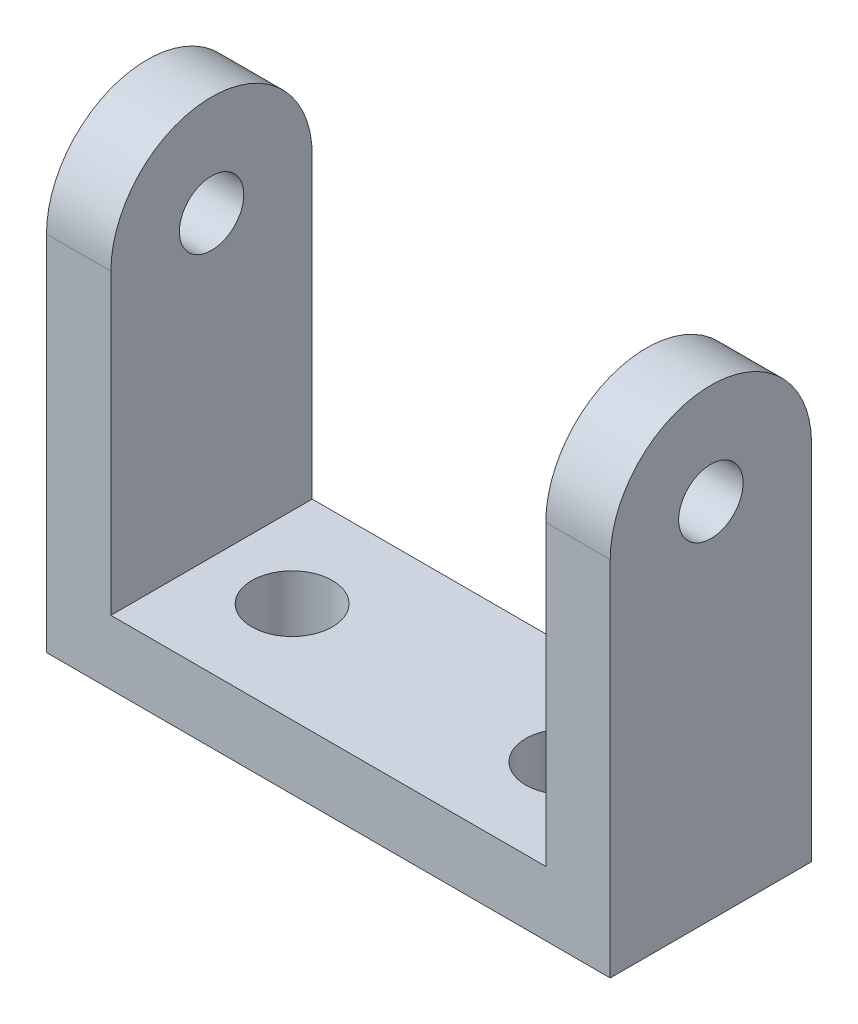
ISO-10303-21;
HEADER;
FILE_DESCRIPTION(('STEP AP214'),'2;1');
FILE_NAME('part.step','',(''),(''),'','','');
FILE_SCHEMA(('AUTOMOTIVE_DESIGN { 1 0 10303 214 1 1 1 1 }'));
ENDSEC;
DATA;
#1=APPLICATION_CONTEXT('core data for automotive mechanical design processes');
#2=APPLICATION_PROTOCOL_DEFINITION('international standard','automotive_design',2000,#1);
#3=PRODUCT_CONTEXT('',#1,'mechanical');
#4=PRODUCT('Part','Part','',(#3));
#5=PRODUCT_RELATED_PRODUCT_CATEGORY('part','',(#4));
#6=PRODUCT_DEFINITION_FORMATION('','',#4);
#7=PRODUCT_DEFINITION_CONTEXT('part definition',#1,'design');
#8=PRODUCT_DEFINITION('design','',#6,#7);
#9=PRODUCT_DEFINITION_SHAPE('','',#8);
#10=(LENGTH_UNIT() NAMED_UNIT(*) SI_UNIT(.MILLI.,.METRE.));
#11=(NAMED_UNIT(*) PLANE_ANGLE_UNIT() SI_UNIT($,.RADIAN.));
#12=(NAMED_UNIT(*) SI_UNIT($,.STERADIAN.) SOLID_ANGLE_UNIT());
#13=UNCERTAINTY_MEASURE_WITH_UNIT(LENGTH_MEASURE(1.E-05),#10,'distance_accuracy_value','');
#14=(GEOMETRIC_REPRESENTATION_CONTEXT(3) GLOBAL_UNCERTAINTY_ASSIGNED_CONTEXT((#13)) GLOBAL_UNIT_ASSIGNED_CONTEXT((#10,
#11,#12)) REPRESENTATION_CONTEXT('',''));
#15=CARTESIAN_POINT('',(0.,0.,0.));
#16=DIRECTION('',(0.,0.,1.));
#17=DIRECTION('',(1.,0.,0.));
#18=AXIS2_PLACEMENT_3D('',#15,#16,#17);
#19=CARTESIAN_POINT('',(35.,0.,-25.));
#20=DIRECTION('',(1.,0.,0.));
#21=DIRECTION('',(0.,0.,-1.));
#22=AXIS2_PLACEMENT_3D('',#19,#20,#21);
#23=PLANE('',#22);
#24=CARTESIAN_POINT('',(35.,45.,-12.5));
#25=DIRECTION('',(1.,0.,0.));
#26=DIRECTION('',(0.,0.,-1.));
#27=AXIS2_PLACEMENT_3D('',#24,#25,#26);
#28=CIRCLE('',#27,3.99999999999999);
#29=CARTESIAN_POINT('',(35.,45.,-16.5));
#30=VERTEX_POINT('',#29);
#31=EDGE_CURVE('E165',#30,#30,#28,.T.);
#32=ORIENTED_EDGE('',*,*,#31,.F.);
#33=EDGE_LOOP('',(#32));
#34=FACE_BOUND('',#33,.T.);
#35=DIRECTION('',(0.,1.,0.));
#36=VECTOR('',#35,1.);
#37=CARTESIAN_POINT('',(35.,0.,0.));
#38=LINE('',#37,#36);
#39=CARTESIAN_POINT('',(35.,0.,0.));
#40=VERTEX_POINT('',#39);
#41=CARTESIAN_POINT('',(35.,45.,0.));
#42=VERTEX_POINT('',#41);
#43=EDGE_CURVE('E178',#40,#42,#38,.T.);
#44=ORIENTED_EDGE('',*,*,#43,.F.);
#45=DIRECTION('',(0.,0.,1.));
#46=VECTOR('',#45,1.);
#47=CARTESIAN_POINT('',(35.,0.,-25.));
#48=LINE('',#47,#46);
#49=CARTESIAN_POINT('',(35.,0.,-25.));
#50=VERTEX_POINT('',#49);
#51=EDGE_CURVE('E11',#50,#40,#48,.T.);
#52=ORIENTED_EDGE('',*,*,#51,.F.);
#53=DIRECTION('',(0.,1.,0.));
#54=VECTOR('',#53,1.);
#55=CARTESIAN_POINT('',(35.,0.,-25.));
#56=LINE('',#55,#54);
#57=CARTESIAN_POINT('',(35.,45.,-25.));
#58=VERTEX_POINT('',#57);
#59=EDGE_CURVE('E182',#50,#58,#56,.T.);
#60=ORIENTED_EDGE('',*,*,#59,.T.);
#61=CARTESIAN_POINT('',(35.,45.,-12.5));
#62=DIRECTION('',(1.,0.,0.));
#63=DIRECTION('',(0.,0.,1.));
#64=AXIS2_PLACEMENT_3D('',#61,#62,#63);
#65=CIRCLE('',#64,12.5);
#66=EDGE_CURVE('E173',#58,#42,#65,.T.);
#67=ORIENTED_EDGE('',*,*,#66,.T.);
#68=EDGE_LOOP('',(#44,#52,#60,#67));
#69=FACE_BOUND('',#68,.T.);
#70=ADVANCED_FACE('F39',(#34,#69),#23,.T.);
#71=CARTESIAN_POINT('',(0.,0.,-25.));
#72=DIRECTION('',(0.,-1.,0.));
#73=DIRECTION('',(0.,0.,-1.));
#74=AXIS2_PLACEMENT_3D('',#71,#72,#73);
#75=PLANE('',#74);
#76=CARTESIAN_POINT('',(-17.,0.,-12.5));
#77=DIRECTION('',(0.,1.,0.));
#78=DIRECTION('',(0.,0.,1.));
#79=AXIS2_PLACEMENT_3D('',#76,#77,#78);
#80=CIRCLE('',#79,5.);
#81=CARTESIAN_POINT('',(-17.,0.,-7.5));
#82=VERTEX_POINT('',#81);
#83=EDGE_CURVE('E232',#82,#82,#80,.T.);
#84=ORIENTED_EDGE('',*,*,#83,.T.);
#85=EDGE_LOOP('',(#84));
#86=FACE_BOUND('',#85,.T.);
#87=CARTESIAN_POINT('',(17.,0.,-12.5));
#88=DIRECTION('',(0.,1.,0.));
#89=DIRECTION('',(0.,0.,1.));
#90=AXIS2_PLACEMENT_3D('',#87,#88,#89);
#91=CIRCLE('',#90,5.);
#92=CARTESIAN_POINT('',(17.,0.,-7.5));
#93=VERTEX_POINT('',#92);
#94=EDGE_CURVE('E161',#93,#93,#91,.T.);
#95=ORIENTED_EDGE('',*,*,#94,.T.);
#96=EDGE_LOOP('',(#95));
#97=FACE_BOUND('',#96,.T.);
#98=DIRECTION('',(1.,0.,0.));
#99=VECTOR('',#98,1.);
#100=CARTESIAN_POINT('',(0.,0.,0.));
#101=LINE('',#100,#99);
#102=CARTESIAN_POINT('',(-35.,0.,0.));
#103=VERTEX_POINT('',#102);
#104=EDGE_CURVE('E185',#103,#40,#101,.T.);
#105=ORIENTED_EDGE('',*,*,#104,.F.);
#106=DIRECTION('',(0.,0.,1.));
#107=VECTOR('',#106,1.);
#108=CARTESIAN_POINT('',(-35.,0.,-25.));
#109=LINE('',#108,#107);
#110=CARTESIAN_POINT('',(-35.,0.,-25.));
#111=VERTEX_POINT('',#110);
#112=EDGE_CURVE('E121',#111,#103,#109,.T.);
#113=ORIENTED_EDGE('',*,*,#112,.F.);
#114=DIRECTION('',(1.,0.,0.));
#115=VECTOR('',#114,1.);
#116=CARTESIAN_POINT('',(0.,0.,-25.));
#117=LINE('',#116,#115);
#118=EDGE_CURVE('E135',#111,#50,#117,.T.);
#119=ORIENTED_EDGE('',*,*,#118,.T.);
#120=ORIENTED_EDGE('',*,*,#51,.T.);
#121=EDGE_LOOP('',(#105,#113,#119,#120));
#122=FACE_BOUND('',#121,.T.);
#123=ADVANCED_FACE('F221',(#86,#97,#122),#75,.T.);
#124=CARTESIAN_POINT('',(0.,8.,-25.));
#125=DIRECTION('',(0.,-1.,0.));
#126=DIRECTION('',(0.,0.,-1.));
#127=AXIS2_PLACEMENT_3D('',#124,#125,#126);
#128=PLANE('',#127);
#129=CARTESIAN_POINT('',(-17.,8.,-12.5));
#130=DIRECTION('',(0.,1.,0.));
#131=DIRECTION('',(0.,0.,1.));
#132=AXIS2_PLACEMENT_3D('',#129,#130,#131);
#133=CIRCLE('',#132,5.);
#134=CARTESIAN_POINT('',(-17.,8.,-7.5));
#135=VERTEX_POINT('',#134);
#136=EDGE_CURVE('E236',#135,#135,#133,.T.);
#137=ORIENTED_EDGE('',*,*,#136,.F.);
#138=EDGE_LOOP('',(#137));
#139=FACE_BOUND('',#138,.T.);
#140=CARTESIAN_POINT('',(17.,8.,-12.5));
#141=DIRECTION('',(0.,1.,0.));
#142=DIRECTION('',(0.,0.,1.));
#143=AXIS2_PLACEMENT_3D('',#140,#141,#142);
#144=CIRCLE('',#143,5.);
#145=CARTESIAN_POINT('',(17.,8.,-7.5));
#146=VERTEX_POINT('',#145);
#147=EDGE_CURVE('E155',#146,#146,#144,.T.);
#148=ORIENTED_EDGE('',*,*,#147,.F.);
#149=EDGE_LOOP('',(#148));
#150=FACE_BOUND('',#149,.T.);
#151=DIRECTION('',(1.,0.,0.));
#152=VECTOR('',#151,1.);
#153=CARTESIAN_POINT('',(0.,8.,0.));
#154=LINE('',#153,#152);
#155=CARTESIAN_POINT('',(-27.,8.,0.));
#156=VERTEX_POINT('',#155);
#157=CARTESIAN_POINT('',(27.,8.,0.));
#158=VERTEX_POINT('',#157);
#159=EDGE_CURVE('E72',#156,#158,#154,.T.);
#160=ORIENTED_EDGE('',*,*,#159,.T.);
#161=DIRECTION('',(0.,0.,1.));
#162=VECTOR('',#161,1.);
#163=CARTESIAN_POINT('',(27.,8.,-25.));
#164=LINE('',#163,#162);
#165=CARTESIAN_POINT('',(27.,8.,-25.));
#166=VERTEX_POINT('',#165);
#167=EDGE_CURVE('E49',#166,#158,#164,.T.);
#168=ORIENTED_EDGE('',*,*,#167,.F.);
#169=DIRECTION('',(1.,0.,0.));
#170=VECTOR('',#169,1.);
#171=CARTESIAN_POINT('',(0.,8.,-25.));
#172=LINE('',#171,#170);
#173=CARTESIAN_POINT('',(-27.,8.,-25.));
#174=VERTEX_POINT('',#173);
#175=EDGE_CURVE('E191',#174,#166,#172,.T.);
#176=ORIENTED_EDGE('',*,*,#175,.F.);
#177=DIRECTION('',(0.,0.,1.));
#178=VECTOR('',#177,1.);
#179=CARTESIAN_POINT('',(-27.,8.,-25.));
#180=LINE('',#179,#178);
#181=EDGE_CURVE('E152',#174,#156,#180,.T.);
#182=ORIENTED_EDGE('',*,*,#181,.T.);
#183=EDGE_LOOP('',(#160,#168,#176,#182));
#184=FACE_BOUND('',#183,.T.);
#185=ADVANCED_FACE('F243',(#139,#150,#184),#128,.F.);
#186=CARTESIAN_POINT('',(27.,0.,-25.));
#187=DIRECTION('',(1.,0.,0.));
#188=DIRECTION('',(0.,0.,-1.));
#189=AXIS2_PLACEMENT_3D('',#186,#187,#188);
#190=PLANE('',#189);
#191=CARTESIAN_POINT('',(27.,45.,-12.5));
#192=DIRECTION('',(1.,0.,0.));
#193=DIRECTION('',(0.,0.,-1.));
#194=AXIS2_PLACEMENT_3D('',#191,#192,#193);
#195=CIRCLE('',#194,3.99999999999999);
#196=CARTESIAN_POINT('',(27.,45.,-16.5));
#197=VERTEX_POINT('',#196);
#198=EDGE_CURVE('E169',#197,#197,#195,.T.);
#199=ORIENTED_EDGE('',*,*,#198,.T.);
#200=EDGE_LOOP('',(#199));
#201=FACE_BOUND('',#200,.T.);
#202=DIRECTION('',(0.,1.,0.));
#203=VECTOR('',#202,1.);
#204=CARTESIAN_POINT('',(27.,0.,0.));
#205=LINE('',#204,#203);
#206=CARTESIAN_POINT('',(27.,45.,0.));
#207=VERTEX_POINT('',#206);
#208=EDGE_CURVE('E202',#158,#207,#205,.T.);
#209=ORIENTED_EDGE('',*,*,#208,.T.);
#210=CARTESIAN_POINT('',(27.,45.,-12.5));
#211=DIRECTION('',(1.,0.,0.));
#212=DIRECTION('',(0.,0.,-1.));
#213=AXIS2_PLACEMENT_3D('',#210,#211,#212);
#214=CIRCLE('',#213,12.5);
#215=CARTESIAN_POINT('',(27.,45.,-25.));
#216=VERTEX_POINT('',#215);
#217=EDGE_CURVE('E174',#207,#216,#214,.F.);
#218=ORIENTED_EDGE('',*,*,#217,.T.);
#219=DIRECTION('',(0.,1.,0.));
#220=VECTOR('',#219,1.);
#221=CARTESIAN_POINT('',(27.,0.,-25.));
#222=LINE('',#221,#220);
#223=EDGE_CURVE('E188',#166,#216,#222,.T.);
#224=ORIENTED_EDGE('',*,*,#223,.F.);
#225=ORIENTED_EDGE('',*,*,#167,.T.);
#226=EDGE_LOOP('',(#209,#218,#224,#225));
#227=FACE_BOUND('',#226,.T.);
#228=ADVANCED_FACE('F213',(#201,#227),#190,.F.);
#229=CARTESIAN_POINT('',(0.,0.,-25.));
#230=DIRECTION('',(0.,0.,-1.));
#231=DIRECTION('',(-1.,0.,0.));
#232=AXIS2_PLACEMENT_3D('',#229,#230,#231);
#233=PLANE('',#232);
#234=ORIENTED_EDGE('',*,*,#59,.F.);
#235=ORIENTED_EDGE('',*,*,#118,.F.);
#236=DIRECTION('',(0.,1.,0.));
#237=VECTOR('',#236,1.);
#238=CARTESIAN_POINT('',(-35.,0.,-25.));
#239=LINE('',#238,#237);
#240=CARTESIAN_POINT('',(-35.,45.,-25.));
#241=VERTEX_POINT('',#240);
#242=EDGE_CURVE('E128',#111,#241,#239,.T.);
#243=ORIENTED_EDGE('',*,*,#242,.T.);
#244=DIRECTION('',(-1.,0.,0.));
#245=VECTOR('',#244,1.);
#246=CARTESIAN_POINT('',(-27.,45.,-25.));
#247=LINE('',#246,#245);
#248=CARTESIAN_POINT('',(-27.,45.,-25.));
#249=VERTEX_POINT('',#248);
#250=EDGE_CURVE('E110',#249,#241,#247,.T.);
#251=ORIENTED_EDGE('',*,*,#250,.F.);
#252=DIRECTION('',(0.,1.,0.));
#253=VECTOR('',#252,1.);
#254=CARTESIAN_POINT('',(-27.,0.,-25.));
#255=LINE('',#254,#253);
#256=EDGE_CURVE('E122',#174,#249,#255,.T.);
#257=ORIENTED_EDGE('',*,*,#256,.F.);
#258=ORIENTED_EDGE('',*,*,#175,.T.);
#259=ORIENTED_EDGE('',*,*,#223,.T.);
#260=DIRECTION('',(1.,0.,0.));
#261=VECTOR('',#260,1.);
#262=CARTESIAN_POINT('',(27.,45.,-25.));
#263=LINE('',#262,#261);
#264=EDGE_CURVE('E83',#216,#58,#263,.T.);
#265=ORIENTED_EDGE('',*,*,#264,.T.);
#266=EDGE_LOOP('',(#234,#235,#243,#251,#257,#258,#259,#265));
#267=FACE_BOUND('',#266,.T.);
#268=ADVANCED_FACE('F134',(#267),#233,.T.);
#269=CARTESIAN_POINT('',(0.,0.,0.));
#270=DIRECTION('',(0.,0.,-1.));
#271=DIRECTION('',(-1.,0.,0.));
#272=AXIS2_PLACEMENT_3D('',#269,#270,#271);
#273=PLANE('',#272);
#274=ORIENTED_EDGE('',*,*,#43,.T.);
#275=DIRECTION('',(1.,0.,0.));
#276=VECTOR('',#275,1.);
#277=CARTESIAN_POINT('',(27.,45.,0.));
#278=LINE('',#277,#276);
#279=EDGE_CURVE('E198',#207,#42,#278,.T.);
#280=ORIENTED_EDGE('',*,*,#279,.F.);
#281=ORIENTED_EDGE('',*,*,#208,.F.);
#282=ORIENTED_EDGE('',*,*,#159,.F.);
#283=DIRECTION('',(0.,1.,0.));
#284=VECTOR('',#283,1.);
#285=CARTESIAN_POINT('',(-27.,0.,0.));
#286=LINE('',#285,#284);
#287=CARTESIAN_POINT('',(-27.,45.,0.));
#288=VERTEX_POINT('',#287);
#289=EDGE_CURVE('E143',#156,#288,#286,.T.);
#290=ORIENTED_EDGE('',*,*,#289,.T.);
#291=DIRECTION('',(-1.,0.,0.));
#292=VECTOR('',#291,1.);
#293=CARTESIAN_POINT('',(-27.,45.,0.));
#294=LINE('',#293,#292);
#295=CARTESIAN_POINT('',(-35.,45.,0.));
#296=VERTEX_POINT('',#295);
#297=EDGE_CURVE('E138',#288,#296,#294,.T.);
#298=ORIENTED_EDGE('',*,*,#297,.T.);
#299=DIRECTION('',(0.,1.,0.));
#300=VECTOR('',#299,1.);
#301=CARTESIAN_POINT('',(-35.,0.,0.));
#302=LINE('',#301,#300);
#303=EDGE_CURVE('E130',#103,#296,#302,.T.);
#304=ORIENTED_EDGE('',*,*,#303,.F.);
#305=ORIENTED_EDGE('',*,*,#104,.T.);
#306=EDGE_LOOP('',(#274,#280,#281,#282,#290,#298,#304,#305));
#307=FACE_BOUND('',#306,.T.);
#308=ADVANCED_FACE('F216',(#307),#273,.F.);
#309=CARTESIAN_POINT('',(-0.950849718747364,45.,-12.5));
#310=DIRECTION('',(1.,0.,0.));
#311=DIRECTION('',(0.,0.,-1.));
#312=AXIS2_PLACEMENT_3D('',#309,#310,#311);
#313=CYLINDRICAL_SURFACE('',#312,12.5);
#314=ORIENTED_EDGE('',*,*,#217,.F.);
#315=ORIENTED_EDGE('',*,*,#279,.T.);
#316=ORIENTED_EDGE('',*,*,#66,.F.);
#317=ORIENTED_EDGE('',*,*,#264,.F.);
#318=EDGE_LOOP('',(#314,#315,#316,#317));
#319=FACE_BOUND('',#318,.T.);
#320=ADVANCED_FACE('F220',(#319),#313,.T.);
#321=CARTESIAN_POINT('',(35.,45.,-12.5));
#322=DIRECTION('',(1.,0.,0.));
#323=DIRECTION('',(0.,0.,-1.));
#324=AXIS2_PLACEMENT_3D('',#321,#322,#323);
#325=CYLINDRICAL_SURFACE('',#324,3.99999999999999);
#326=ORIENTED_EDGE('',*,*,#31,.T.);
#327=EDGE_LOOP('',(#326));
#328=FACE_BOUND('',#327,.T.);
#329=ORIENTED_EDGE('',*,*,#198,.F.);
#330=EDGE_LOOP('',(#329));
#331=FACE_BOUND('',#330,.T.);
#332=ADVANCED_FACE('F251',(#328,#331),#325,.F.);
#333=CARTESIAN_POINT('',(17.,8.,-12.5));
#334=DIRECTION('',(0.,1.,0.));
#335=DIRECTION('',(0.,0.,1.));
#336=AXIS2_PLACEMENT_3D('',#333,#334,#335);
#337=CYLINDRICAL_SURFACE('',#336,5.);
#338=ORIENTED_EDGE('',*,*,#94,.F.);
#339=EDGE_LOOP('',(#338));
#340=FACE_BOUND('',#339,.T.);
#341=ORIENTED_EDGE('',*,*,#147,.T.);
#342=EDGE_LOOP('',(#341));
#343=FACE_BOUND('',#342,.T.);
#344=ADVANCED_FACE('F249',(#340,#343),#337,.F.);
#345=CARTESIAN_POINT('',(-35.,0.,-25.));
#346=DIRECTION('',(1.,0.,0.));
#347=DIRECTION('',(0.,0.,-1.));
#348=AXIS2_PLACEMENT_3D('',#345,#346,#347);
#349=PLANE('',#348);
#350=CARTESIAN_POINT('',(-35.,45.,-12.5));
#351=DIRECTION('',(-1.,0.,0.));
#352=DIRECTION('',(0.,0.,1.));
#353=AXIS2_PLACEMENT_3D('',#350,#351,#352);
#354=CIRCLE('',#353,3.99999999999999);
#355=CARTESIAN_POINT('',(-35.,45.,-8.50000000000001));
#356=VERTEX_POINT('',#355);
#357=EDGE_CURVE('E228',#356,#356,#354,.T.);
#358=ORIENTED_EDGE('',*,*,#357,.F.);
#359=EDGE_LOOP('',(#358));
#360=FACE_BOUND('',#359,.T.);
#361=ORIENTED_EDGE('',*,*,#303,.T.);
#362=CARTESIAN_POINT('',(-35.,45.,-12.5));
#363=DIRECTION('',(1.,0.,0.));
#364=DIRECTION('',(0.,0.,1.));
#365=AXIS2_PLACEMENT_3D('',#362,#363,#364);
#366=CIRCLE('',#365,12.5);
#367=EDGE_CURVE('E113',#241,#296,#366,.T.);
#368=ORIENTED_EDGE('',*,*,#367,.F.);
#369=ORIENTED_EDGE('',*,*,#242,.F.);
#370=ORIENTED_EDGE('',*,*,#112,.T.);
#371=EDGE_LOOP('',(#361,#368,#369,#370));
#372=FACE_BOUND('',#371,.T.);
#373=ADVANCED_FACE('F126',(#360,#372),#349,.F.);
#374=CARTESIAN_POINT('',(-27.,0.,-25.));
#375=DIRECTION('',(1.,0.,0.));
#376=DIRECTION('',(0.,0.,-1.));
#377=AXIS2_PLACEMENT_3D('',#374,#375,#376);
#378=PLANE('',#377);
#379=CARTESIAN_POINT('',(-27.,45.,-12.5));
#380=DIRECTION('',(1.,0.,0.));
#381=DIRECTION('',(0.,0.,-1.));
#382=AXIS2_PLACEMENT_3D('',#379,#380,#381);
#383=CIRCLE('',#382,3.99999999999999);
#384=CARTESIAN_POINT('',(-27.,45.,-16.5));
#385=VERTEX_POINT('',#384);
#386=EDGE_CURVE('E42',#385,#385,#383,.T.);
#387=ORIENTED_EDGE('',*,*,#386,.F.);
#388=EDGE_LOOP('',(#387));
#389=FACE_BOUND('',#388,.T.);
#390=ORIENTED_EDGE('',*,*,#289,.F.);
#391=ORIENTED_EDGE('',*,*,#181,.F.);
#392=ORIENTED_EDGE('',*,*,#256,.T.);
#393=CARTESIAN_POINT('',(-27.,45.,-12.5));
#394=DIRECTION('',(-1.,0.,0.));
#395=DIRECTION('',(0.,0.,1.));
#396=AXIS2_PLACEMENT_3D('',#393,#394,#395);
#397=CIRCLE('',#396,12.5);
#398=EDGE_CURVE('E116',#288,#249,#397,.T.);
#399=ORIENTED_EDGE('',*,*,#398,.F.);
#400=EDGE_LOOP('',(#390,#391,#392,#399));
#401=FACE_BOUND('',#400,.T.);
#402=ADVANCED_FACE('F224',(#389,#401),#378,.T.);
#403=CARTESIAN_POINT('',(54.9508497187474,45.,-12.5));
#404=DIRECTION('',(-1.,0.,0.));
#405=DIRECTION('',(0.,0.,1.));
#406=AXIS2_PLACEMENT_3D('',#403,#404,#405);
#407=CYLINDRICAL_SURFACE('',#406,12.5);
#408=ORIENTED_EDGE('',*,*,#297,.F.);
#409=ORIENTED_EDGE('',*,*,#398,.T.);
#410=ORIENTED_EDGE('',*,*,#250,.T.);
#411=ORIENTED_EDGE('',*,*,#367,.T.);
#412=EDGE_LOOP('',(#408,#409,#410,#411));
#413=FACE_BOUND('',#412,.T.);
#414=ADVANCED_FACE('F112',(#413),#407,.T.);
#415=CARTESIAN_POINT('',(-35.,45.,-12.5));
#416=DIRECTION('',(-1.,0.,0.));
#417=DIRECTION('',(0.,0.,1.));
#418=AXIS2_PLACEMENT_3D('',#415,#416,#417);
#419=CYLINDRICAL_SURFACE('',#418,3.99999999999999);
#420=ORIENTED_EDGE('',*,*,#386,.T.);
#421=EDGE_LOOP('',(#420));
#422=FACE_BOUND('',#421,.T.);
#423=ORIENTED_EDGE('',*,*,#357,.T.);
#424=EDGE_LOOP('',(#423));
#425=FACE_BOUND('',#424,.T.);
#426=ADVANCED_FACE('F349',(#422,#425),#419,.F.);
#427=CARTESIAN_POINT('',(-17.,8.,-12.5));
#428=DIRECTION('',(0.,1.,0.));
#429=DIRECTION('',(0.,0.,1.));
#430=AXIS2_PLACEMENT_3D('',#427,#428,#429);
#431=CYLINDRICAL_SURFACE('',#430,5.);
#432=ORIENTED_EDGE('',*,*,#83,.F.);
#433=EDGE_LOOP('',(#432));
#434=FACE_BOUND('',#433,.T.);
#435=ORIENTED_EDGE('',*,*,#136,.T.);
#436=EDGE_LOOP('',(#435));
#437=FACE_BOUND('',#436,.T.);
#438=ADVANCED_FACE('F241',(#434,#437),#431,.F.);
#439=CLOSED_SHELL('',(#70,#123,#185,#228,#268,#308,#320,#332,#344,#373,#402,#414,#426,#438));
#440=MANIFOLD_SOLID_BREP('B2',#439);
#441=ADVANCED_BREP_SHAPE_REPRESENTATION('',(#18,#440),#14);
#442=SHAPE_DEFINITION_REPRESENTATION(#9,#441);
ENDSEC;
END-ISO-10303-21;
